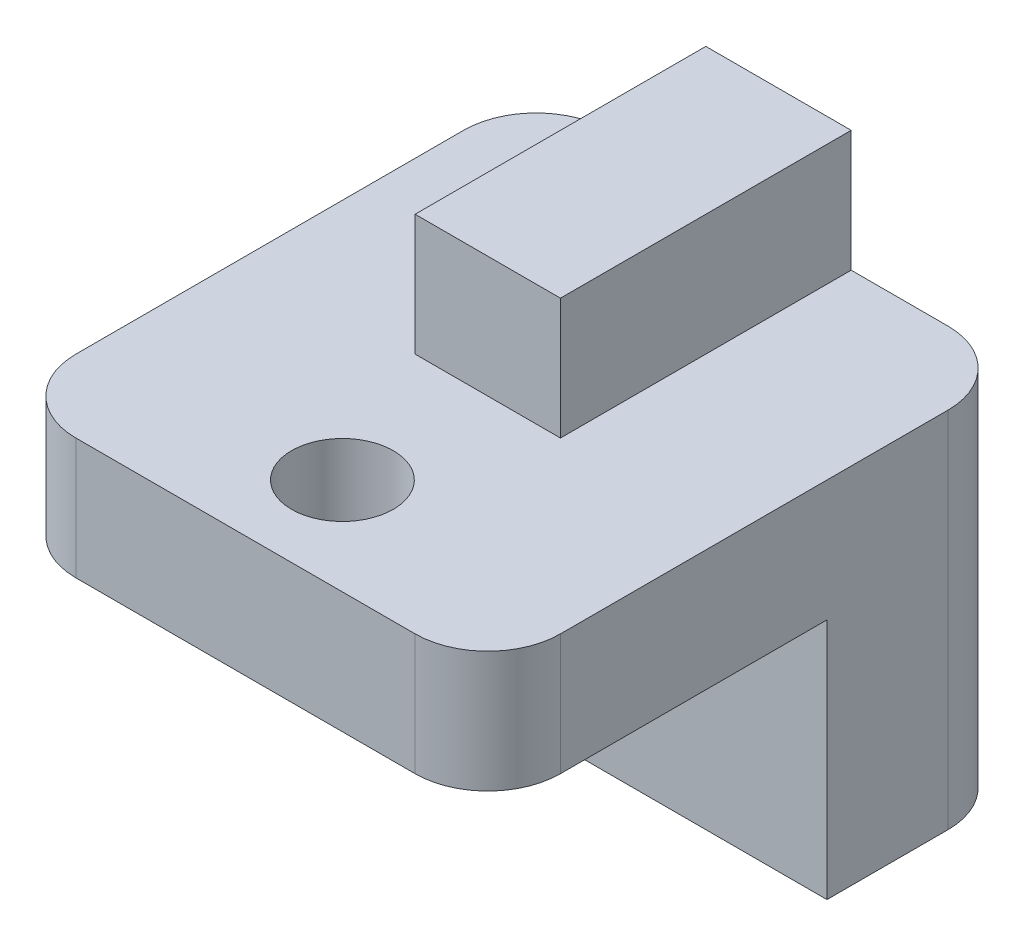
ISO-10303-21;
HEADER;
FILE_DESCRIPTION(('STEP AP214'),'2;1');
FILE_NAME('part.step','',(''),(''),'','','');
FILE_SCHEMA(('AUTOMOTIVE_DESIGN { 1 0 10303 214 1 1 1 1 }'));
ENDSEC;
DATA;
#1=APPLICATION_CONTEXT('core data for automotive mechanical design processes');
#2=APPLICATION_PROTOCOL_DEFINITION('international standard','automotive_design',2000,#1);
#3=PRODUCT_CONTEXT('',#1,'mechanical');
#4=PRODUCT('Part','Part','',(#3));
#5=PRODUCT_RELATED_PRODUCT_CATEGORY('part','',(#4));
#6=PRODUCT_DEFINITION_FORMATION('','',#4);
#7=PRODUCT_DEFINITION_CONTEXT('part definition',#1,'design');
#8=PRODUCT_DEFINITION('design','',#6,#7);
#9=PRODUCT_DEFINITION_SHAPE('','',#8);
#10=(LENGTH_UNIT() NAMED_UNIT(*) SI_UNIT(.MILLI.,.METRE.));
#11=(NAMED_UNIT(*) PLANE_ANGLE_UNIT() SI_UNIT($,.RADIAN.));
#12=(NAMED_UNIT(*) SI_UNIT($,.STERADIAN.) SOLID_ANGLE_UNIT());
#13=UNCERTAINTY_MEASURE_WITH_UNIT(LENGTH_MEASURE(1.E-05),#10,'distance_accuracy_value','');
#14=(GEOMETRIC_REPRESENTATION_CONTEXT(3) GLOBAL_UNCERTAINTY_ASSIGNED_CONTEXT((#13)) GLOBAL_UNIT_ASSIGNED_CONTEXT((#10,
#11,#12)) REPRESENTATION_CONTEXT('',''));
#15=CARTESIAN_POINT('',(0.,0.,0.));
#16=DIRECTION('',(0.,0.,1.));
#17=DIRECTION('',(1.,0.,0.));
#18=AXIS2_PLACEMENT_3D('',#15,#16,#17);
#19=CARTESIAN_POINT('',(0.,0.,0.));
#20=DIRECTION('',(0.,1.,0.));
#21=DIRECTION('',(0.,0.,1.));
#22=AXIS2_PLACEMENT_3D('',#19,#20,#21);
#23=PLANE('',#22);
#24=CARTESIAN_POINT('',(10.,0.,-4.));
#25=DIRECTION('',(0.,1.,0.));
#26=DIRECTION('',(0.,0.,1.));
#27=AXIS2_PLACEMENT_3D('',#24,#25,#26);
#28=CIRCLE('',#27,2.1);
#29=CARTESIAN_POINT('',(10.,0.,-1.9));
#30=VERTEX_POINT('',#29);
#31=EDGE_CURVE('E221',#30,#30,#28,.T.);
#32=ORIENTED_EDGE('',*,*,#31,.T.);
#33=EDGE_LOOP('',(#32));
#34=FACE_BOUND('',#33,.T.);
#35=DIRECTION('',(-1.,0.,0.));
#36=VECTOR('',#35,1.);
#37=CARTESIAN_POINT('',(20.,0.,-14.));
#38=LINE('',#37,#36);
#39=CARTESIAN_POINT('',(20.,0.,-14.));
#40=VERTEX_POINT('',#39);
#41=CARTESIAN_POINT('',(0.,0.,-14.));
#42=VERTEX_POINT('',#41);
#43=EDGE_CURVE('E54',#40,#42,#38,.T.);
#44=ORIENTED_EDGE('',*,*,#43,.F.);
#45=DIRECTION('',(0.,0.,-1.));
#46=VECTOR('',#45,1.);
#47=CARTESIAN_POINT('',(20.,0.,0.));
#48=LINE('',#47,#46);
#49=CARTESIAN_POINT('',(20.,0.,-3.));
#50=VERTEX_POINT('',#49);
#51=EDGE_CURVE('E245',#50,#40,#48,.T.);
#52=ORIENTED_EDGE('',*,*,#51,.F.);
#53=CARTESIAN_POINT('',(17.,0.,-3.));
#54=DIRECTION('',(0.,1.,0.));
#55=DIRECTION('',(0.,0.,1.));
#56=AXIS2_PLACEMENT_3D('',#53,#54,#55);
#57=CIRCLE('',#56,3.);
#58=CARTESIAN_POINT('',(17.,0.,0.));
#59=VERTEX_POINT('',#58);
#60=EDGE_CURVE('E472',#50,#59,#57,.F.);
#61=ORIENTED_EDGE('',*,*,#60,.T.);
#62=DIRECTION('',(1.,0.,0.));
#63=VECTOR('',#62,1.);
#64=CARTESIAN_POINT('',(0.,0.,0.));
#65=LINE('',#64,#63);
#66=CARTESIAN_POINT('',(3.,0.,0.));
#67=VERTEX_POINT('',#66);
#68=EDGE_CURVE('E252',#67,#59,#65,.T.);
#69=ORIENTED_EDGE('',*,*,#68,.F.);
#70=CARTESIAN_POINT('',(3.,0.,-3.));
#71=DIRECTION('',(0.,1.,0.));
#72=DIRECTION('',(0.,0.,1.));
#73=AXIS2_PLACEMENT_3D('',#70,#71,#72);
#74=CIRCLE('',#73,3.);
#75=CARTESIAN_POINT('',(0.,0.,-3.));
#76=VERTEX_POINT('',#75);
#77=EDGE_CURVE('E456',#67,#76,#74,.F.);
#78=ORIENTED_EDGE('',*,*,#77,.T.);
#79=DIRECTION('',(0.,0.,-1.));
#80=VECTOR('',#79,1.);
#81=CARTESIAN_POINT('',(0.,0.,0.));
#82=LINE('',#81,#80);
#83=EDGE_CURVE('E185',#76,#42,#82,.T.);
#84=ORIENTED_EDGE('',*,*,#83,.T.);
#85=EDGE_LOOP('',(#44,#52,#61,#69,#78,#84));
#86=FACE_BOUND('',#85,.T.);
#87=ADVANCED_FACE('F37',(#34,#86),#23,.F.);
#88=CARTESIAN_POINT('',(0.,5.,0.));
#89=DIRECTION('',(0.,1.,0.));
#90=DIRECTION('',(0.,0.,1.));
#91=AXIS2_PLACEMENT_3D('',#88,#89,#90);
#92=PLANE('',#91);
#93=CARTESIAN_POINT('',(10.,5.,-4.));
#94=DIRECTION('',(0.,1.,0.));
#95=DIRECTION('',(0.,0.,1.));
#96=AXIS2_PLACEMENT_3D('',#93,#94,#95);
#97=CIRCLE('',#96,2.1);
#98=CARTESIAN_POINT('',(10.,5.,-1.9));
#99=VERTEX_POINT('',#98);
#100=EDGE_CURVE('E152',#99,#99,#97,.T.);
#101=ORIENTED_EDGE('',*,*,#100,.F.);
#102=EDGE_LOOP('',(#101));
#103=FACE_BOUND('',#102,.T.);
#104=DIRECTION('',(1.,0.,0.));
#105=VECTOR('',#104,1.);
#106=CARTESIAN_POINT('',(0.,5.,0.));
#107=LINE('',#106,#105);
#108=CARTESIAN_POINT('',(3.,5.,0.));
#109=VERTEX_POINT('',#108);
#110=CARTESIAN_POINT('',(17.,5.,0.));
#111=VERTEX_POINT('',#110);
#112=EDGE_CURVE('E461',#109,#111,#107,.T.);
#113=ORIENTED_EDGE('',*,*,#112,.T.);
#114=CARTESIAN_POINT('',(17.,5.,-3.));
#115=DIRECTION('',(0.,1.,0.));
#116=DIRECTION('',(0.,0.,1.));
#117=AXIS2_PLACEMENT_3D('',#114,#115,#116);
#118=CIRCLE('',#117,3.);
#119=CARTESIAN_POINT('',(20.,5.,-3.));
#120=VERTEX_POINT('',#119);
#121=EDGE_CURVE('E239',#111,#120,#118,.T.);
#122=ORIENTED_EDGE('',*,*,#121,.T.);
#123=DIRECTION('',(0.,0.,-1.));
#124=VECTOR('',#123,1.);
#125=CARTESIAN_POINT('',(20.,5.,0.));
#126=LINE('',#125,#124);
#127=CARTESIAN_POINT('',(20.,5.,-19.));
#128=VERTEX_POINT('',#127);
#129=EDGE_CURVE('E218',#120,#128,#126,.T.);
#130=ORIENTED_EDGE('',*,*,#129,.T.);
#131=CARTESIAN_POINT('',(17.,5.,-19.));
#132=DIRECTION('',(0.,1.,0.));
#133=DIRECTION('',(0.,0.,1.));
#134=AXIS2_PLACEMENT_3D('',#131,#132,#133);
#135=CIRCLE('',#134,3.);
#136=CARTESIAN_POINT('',(17.,5.,-22.));
#137=VERTEX_POINT('',#136);
#138=EDGE_CURVE('E147',#128,#137,#135,.T.);
#139=ORIENTED_EDGE('',*,*,#138,.T.);
#140=DIRECTION('',(1.,0.,0.));
#141=VECTOR('',#140,1.);
#142=CARTESIAN_POINT('',(0.,5.,-22.));
#143=LINE('',#142,#141);
#144=CARTESIAN_POINT('',(13.,5.,-22.));
#145=VERTEX_POINT('',#144);
#146=EDGE_CURVE('E220',#145,#137,#143,.T.);
#147=ORIENTED_EDGE('',*,*,#146,.F.);
#148=DIRECTION('',(0.,0.,1.));
#149=VECTOR('',#148,1.);
#150=CARTESIAN_POINT('',(13.,5.,0.));
#151=LINE('',#150,#149);
#152=CARTESIAN_POINT('',(13.,5.,-10.));
#153=VERTEX_POINT('',#152);
#154=EDGE_CURVE('E191',#145,#153,#151,.T.);
#155=ORIENTED_EDGE('',*,*,#154,.T.);
#156=DIRECTION('',(1.,0.,0.));
#157=VECTOR('',#156,1.);
#158=CARTESIAN_POINT('',(0.,5.,-10.));
#159=LINE('',#158,#157);
#160=CARTESIAN_POINT('',(6.99999999999999,5.,-10.));
#161=VERTEX_POINT('',#160);
#162=EDGE_CURVE('E198',#161,#153,#159,.T.);
#163=ORIENTED_EDGE('',*,*,#162,.F.);
#164=DIRECTION('',(0.,0.,1.));
#165=VECTOR('',#164,1.);
#166=CARTESIAN_POINT('',(7.,5.,0.));
#167=LINE('',#166,#165);
#168=CARTESIAN_POINT('',(6.99999999999999,5.,-22.));
#169=VERTEX_POINT('',#168);
#170=EDGE_CURVE('E193',#169,#161,#167,.T.);
#171=ORIENTED_EDGE('',*,*,#170,.F.);
#172=CARTESIAN_POINT('',(3.,5.,-22.));
#173=VERTEX_POINT('',#172);
#174=EDGE_CURVE('E230',#173,#169,#143,.T.);
#175=ORIENTED_EDGE('',*,*,#174,.F.);
#176=CARTESIAN_POINT('',(3.,5.,-19.));
#177=DIRECTION('',(0.,1.,0.));
#178=DIRECTION('',(0.,0.,1.));
#179=AXIS2_PLACEMENT_3D('',#176,#177,#178);
#180=CIRCLE('',#179,3.);
#181=CARTESIAN_POINT('',(0.,5.,-19.));
#182=VERTEX_POINT('',#181);
#183=EDGE_CURVE('E62',#173,#182,#180,.T.);
#184=ORIENTED_EDGE('',*,*,#183,.T.);
#185=DIRECTION('',(0.,0.,-1.));
#186=VECTOR('',#185,1.);
#187=CARTESIAN_POINT('',(0.,5.,0.));
#188=LINE('',#187,#186);
#189=CARTESIAN_POINT('',(0.,5.,-3.));
#190=VERTEX_POINT('',#189);
#191=EDGE_CURVE('E224',#190,#182,#188,.T.);
#192=ORIENTED_EDGE('',*,*,#191,.F.);
#193=CARTESIAN_POINT('',(3.,5.,-3.));
#194=DIRECTION('',(0.,1.,0.));
#195=DIRECTION('',(0.,0.,1.));
#196=AXIS2_PLACEMENT_3D('',#193,#194,#195);
#197=CIRCLE('',#196,3.);
#198=EDGE_CURVE('E237',#190,#109,#197,.T.);
#199=ORIENTED_EDGE('',*,*,#198,.T.);
#200=EDGE_LOOP('',(#113,#122,#130,#139,#147,#155,#163,#171,#175,#184,#192,#199));
#201=FACE_BOUND('',#200,.T.);
#202=ADVANCED_FACE('F277',(#103,#201),#92,.T.);
#203=CARTESIAN_POINT('',(20.,5.,0.));
#204=DIRECTION('',(-1.,0.,0.));
#205=DIRECTION('',(0.,0.,1.));
#206=AXIS2_PLACEMENT_3D('',#203,#204,#205);
#207=PLANE('',#206);
#208=ORIENTED_EDGE('',*,*,#129,.F.);
#209=DIRECTION('',(0.,-1.,0.));
#210=VECTOR('',#209,1.);
#211=CARTESIAN_POINT('',(20.,5.,-3.));
#212=LINE('',#211,#210);
#213=EDGE_CURVE('E151',#120,#50,#212,.T.);
#214=ORIENTED_EDGE('',*,*,#213,.T.);
#215=ORIENTED_EDGE('',*,*,#51,.T.);
#216=DIRECTION('',(0.,1.,0.));
#217=VECTOR('',#216,1.);
#218=CARTESIAN_POINT('',(20.,-10.,-14.));
#219=LINE('',#218,#217);
#220=CARTESIAN_POINT('',(20.,-10.,-14.));
#221=VERTEX_POINT('',#220);
#222=EDGE_CURVE('E158',#221,#40,#219,.T.);
#223=ORIENTED_EDGE('',*,*,#222,.F.);
#224=DIRECTION('',(0.,0.,1.));
#225=VECTOR('',#224,1.);
#226=CARTESIAN_POINT('',(20.,-10.,-14.));
#227=LINE('',#226,#225);
#228=CARTESIAN_POINT('',(20.,-10.,-19.));
#229=VERTEX_POINT('',#228);
#230=EDGE_CURVE('E155',#229,#221,#227,.T.);
#231=ORIENTED_EDGE('',*,*,#230,.F.);
#232=DIRECTION('',(0.,-1.,0.));
#233=VECTOR('',#232,1.);
#234=CARTESIAN_POINT('',(20.,5.,-19.));
#235=LINE('',#234,#233);
#236=EDGE_CURVE('E142',#229,#128,#235,.F.);
#237=ORIENTED_EDGE('',*,*,#236,.T.);
#238=EDGE_LOOP('',(#208,#214,#215,#223,#231,#237));
#239=FACE_BOUND('',#238,.T.);
#240=ADVANCED_FACE('F156',(#239),#207,.F.);
#241=CARTESIAN_POINT('',(0.,5.,-22.));
#242=DIRECTION('',(0.,0.,-1.));
#243=DIRECTION('',(-1.,0.,0.));
#244=AXIS2_PLACEMENT_3D('',#241,#242,#243);
#245=PLANE('',#244);
#246=DIRECTION('',(0.,-1.,0.));
#247=VECTOR('',#246,1.);
#248=CARTESIAN_POINT('',(17.,0.,-22.));
#249=LINE('',#248,#247);
#250=CARTESIAN_POINT('',(17.,-10.,-22.));
#251=VERTEX_POINT('',#250);
#252=EDGE_CURVE('E46',#137,#251,#249,.T.);
#253=ORIENTED_EDGE('',*,*,#252,.T.);
#254=DIRECTION('',(1.,0.,0.));
#255=VECTOR('',#254,1.);
#256=CARTESIAN_POINT('',(3.,-10.,-22.));
#257=LINE('',#256,#255);
#258=CARTESIAN_POINT('',(3.,-10.,-22.));
#259=VERTEX_POINT('',#258);
#260=EDGE_CURVE('E167',#259,#251,#257,.T.);
#261=ORIENTED_EDGE('',*,*,#260,.F.);
#262=DIRECTION('',(0.,-1.,0.));
#263=VECTOR('',#262,1.);
#264=CARTESIAN_POINT('',(3.,5.,-22.));
#265=LINE('',#264,#263);
#266=EDGE_CURVE('E11',#259,#173,#265,.F.);
#267=ORIENTED_EDGE('',*,*,#266,.T.);
#268=ORIENTED_EDGE('',*,*,#174,.T.);
#269=DIRECTION('',(0.,-1.,0.));
#270=VECTOR('',#269,1.);
#271=CARTESIAN_POINT('',(6.99999999999999,10.,-22.));
#272=LINE('',#271,#270);
#273=CARTESIAN_POINT('',(6.99999999999999,10.,-22.));
#274=VERTEX_POINT('',#273);
#275=EDGE_CURVE('E217',#274,#169,#272,.T.);
#276=ORIENTED_EDGE('',*,*,#275,.F.);
#277=DIRECTION('',(1.,0.,0.));
#278=VECTOR('',#277,1.);
#279=CARTESIAN_POINT('',(0.,10.,-22.));
#280=LINE('',#279,#278);
#281=CARTESIAN_POINT('',(13.,10.,-22.));
#282=VERTEX_POINT('',#281);
#283=EDGE_CURVE('E476',#274,#282,#280,.T.);
#284=ORIENTED_EDGE('',*,*,#283,.T.);
#285=DIRECTION('',(0.,-1.,0.));
#286=VECTOR('',#285,1.);
#287=CARTESIAN_POINT('',(13.,10.,-22.));
#288=LINE('',#287,#286);
#289=EDGE_CURVE('E247',#282,#145,#288,.T.);
#290=ORIENTED_EDGE('',*,*,#289,.T.);
#291=ORIENTED_EDGE('',*,*,#146,.T.);
#292=EDGE_LOOP('',(#253,#261,#267,#268,#276,#284,#290,#291));
#293=FACE_BOUND('',#292,.T.);
#294=ADVANCED_FACE('F373',(#293),#245,.T.);
#295=CARTESIAN_POINT('',(0.,5.,0.));
#296=DIRECTION('',(-1.,0.,0.));
#297=DIRECTION('',(0.,0.,1.));
#298=AXIS2_PLACEMENT_3D('',#295,#296,#297);
#299=PLANE('',#298);
#300=ORIENTED_EDGE('',*,*,#83,.F.);
#301=DIRECTION('',(0.,-1.,0.));
#302=VECTOR('',#301,1.);
#303=CARTESIAN_POINT('',(0.,5.,-3.));
#304=LINE('',#303,#302);
#305=EDGE_CURVE('E243',#76,#190,#304,.F.);
#306=ORIENTED_EDGE('',*,*,#305,.T.);
#307=ORIENTED_EDGE('',*,*,#191,.T.);
#308=DIRECTION('',(0.,-1.,0.));
#309=VECTOR('',#308,1.);
#310=CARTESIAN_POINT('',(0.,5.,-19.));
#311=LINE('',#310,#309);
#312=CARTESIAN_POINT('',(0.,-10.,-19.));
#313=VERTEX_POINT('',#312);
#314=EDGE_CURVE('E241',#182,#313,#311,.T.);
#315=ORIENTED_EDGE('',*,*,#314,.T.);
#316=DIRECTION('',(0.,0.,-1.));
#317=VECTOR('',#316,1.);
#318=CARTESIAN_POINT('',(0.,-10.,-14.));
#319=LINE('',#318,#317);
#320=CARTESIAN_POINT('',(0.,-10.,-14.));
#321=VERTEX_POINT('',#320);
#322=EDGE_CURVE('E172',#321,#313,#319,.T.);
#323=ORIENTED_EDGE('',*,*,#322,.F.);
#324=DIRECTION('',(0.,1.,0.));
#325=VECTOR('',#324,1.);
#326=CARTESIAN_POINT('',(0.,-10.,-14.));
#327=LINE('',#326,#325);
#328=EDGE_CURVE('E178',#321,#42,#327,.T.);
#329=ORIENTED_EDGE('',*,*,#328,.T.);
#330=EDGE_LOOP('',(#300,#306,#307,#315,#323,#329));
#331=FACE_BOUND('',#330,.T.);
#332=ADVANCED_FACE('F271',(#331),#299,.T.);
#333=CARTESIAN_POINT('',(0.,5.,0.));
#334=DIRECTION('',(0.,0.,-1.));
#335=DIRECTION('',(-1.,0.,0.));
#336=AXIS2_PLACEMENT_3D('',#333,#334,#335);
#337=PLANE('',#336);
#338=ORIENTED_EDGE('',*,*,#68,.T.);
#339=DIRECTION('',(0.,-1.,0.));
#340=VECTOR('',#339,1.);
#341=CARTESIAN_POINT('',(17.,5.,0.));
#342=LINE('',#341,#340);
#343=EDGE_CURVE('E233',#59,#111,#342,.F.);
#344=ORIENTED_EDGE('',*,*,#343,.T.);
#345=ORIENTED_EDGE('',*,*,#112,.F.);
#346=DIRECTION('',(0.,-1.,0.));
#347=VECTOR('',#346,1.);
#348=CARTESIAN_POINT('',(3.,0.,0.));
#349=LINE('',#348,#347);
#350=EDGE_CURVE('E458',#109,#67,#349,.T.);
#351=ORIENTED_EDGE('',*,*,#350,.T.);
#352=EDGE_LOOP('',(#338,#344,#345,#351));
#353=FACE_BOUND('',#352,.T.);
#354=ADVANCED_FACE('F261',(#353),#337,.F.);
#355=CARTESIAN_POINT('',(10.,5.,-4.));
#356=DIRECTION('',(0.,-1.,0.));
#357=DIRECTION('',(0.,0.,-1.));
#358=AXIS2_PLACEMENT_3D('',#355,#356,#357);
#359=CYLINDRICAL_SURFACE('',#358,2.1);
#360=ORIENTED_EDGE('',*,*,#100,.T.);
#361=EDGE_LOOP('',(#360));
#362=FACE_BOUND('',#361,.T.);
#363=ORIENTED_EDGE('',*,*,#31,.F.);
#364=EDGE_LOOP('',(#363));
#365=FACE_BOUND('',#364,.T.);
#366=ADVANCED_FACE('F258',(#362,#365),#359,.F.);
#367=CARTESIAN_POINT('',(13.,10.,0.));
#368=DIRECTION('',(1.,0.,0.));
#369=DIRECTION('',(0.,0.,-1.));
#370=AXIS2_PLACEMENT_3D('',#367,#368,#369);
#371=PLANE('',#370);
#372=ORIENTED_EDGE('',*,*,#154,.F.);
#373=ORIENTED_EDGE('',*,*,#289,.F.);
#374=DIRECTION('',(0.,0.,1.));
#375=VECTOR('',#374,1.);
#376=CARTESIAN_POINT('',(13.,10.,0.));
#377=LINE('',#376,#375);
#378=CARTESIAN_POINT('',(13.,10.,-10.));
#379=VERTEX_POINT('',#378);
#380=EDGE_CURVE('E181',#282,#379,#377,.T.);
#381=ORIENTED_EDGE('',*,*,#380,.T.);
#382=DIRECTION('',(0.,-1.,0.));
#383=VECTOR('',#382,1.);
#384=CARTESIAN_POINT('',(13.,10.,-10.));
#385=LINE('',#384,#383);
#386=EDGE_CURVE('E212',#379,#153,#385,.T.);
#387=ORIENTED_EDGE('',*,*,#386,.T.);
#388=EDGE_LOOP('',(#372,#373,#381,#387));
#389=FACE_BOUND('',#388,.T.);
#390=ADVANCED_FACE('F260',(#389),#371,.T.);
#391=CARTESIAN_POINT('',(7.,10.,0.));
#392=DIRECTION('',(1.,0.,0.));
#393=DIRECTION('',(0.,0.,-1.));
#394=AXIS2_PLACEMENT_3D('',#391,#392,#393);
#395=PLANE('',#394);
#396=ORIENTED_EDGE('',*,*,#170,.T.);
#397=DIRECTION('',(0.,-1.,0.));
#398=VECTOR('',#397,1.);
#399=CARTESIAN_POINT('',(6.99999999999999,10.,-10.));
#400=LINE('',#399,#398);
#401=CARTESIAN_POINT('',(6.99999999999999,10.,-10.));
#402=VERTEX_POINT('',#401);
#403=EDGE_CURVE('E214',#402,#161,#400,.T.);
#404=ORIENTED_EDGE('',*,*,#403,.F.);
#405=DIRECTION('',(0.,0.,1.));
#406=VECTOR('',#405,1.);
#407=CARTESIAN_POINT('',(7.,10.,0.));
#408=LINE('',#407,#406);
#409=EDGE_CURVE('E485',#274,#402,#408,.T.);
#410=ORIENTED_EDGE('',*,*,#409,.F.);
#411=ORIENTED_EDGE('',*,*,#275,.T.);
#412=EDGE_LOOP('',(#396,#404,#410,#411));
#413=FACE_BOUND('',#412,.T.);
#414=ADVANCED_FACE('F268',(#413),#395,.F.);
#415=CARTESIAN_POINT('',(0.,10.,-10.));
#416=DIRECTION('',(0.,0.,-1.));
#417=DIRECTION('',(-1.,0.,0.));
#418=AXIS2_PLACEMENT_3D('',#415,#416,#417);
#419=PLANE('',#418);
#420=ORIENTED_EDGE('',*,*,#162,.T.);
#421=ORIENTED_EDGE('',*,*,#386,.F.);
#422=DIRECTION('',(1.,0.,0.));
#423=VECTOR('',#422,1.);
#424=CARTESIAN_POINT('',(0.,10.,-10.));
#425=LINE('',#424,#423);
#426=EDGE_CURVE('E208',#402,#379,#425,.T.);
#427=ORIENTED_EDGE('',*,*,#426,.F.);
#428=ORIENTED_EDGE('',*,*,#403,.T.);
#429=EDGE_LOOP('',(#420,#421,#427,#428));
#430=FACE_BOUND('',#429,.T.);
#431=ADVANCED_FACE('F286',(#430),#419,.F.);
#432=CARTESIAN_POINT('',(0.,10.,0.));
#433=DIRECTION('',(0.,1.,0.));
#434=DIRECTION('',(0.,0.,1.));
#435=AXIS2_PLACEMENT_3D('',#432,#433,#434);
#436=PLANE('',#435);
#437=ORIENTED_EDGE('',*,*,#380,.F.);
#438=ORIENTED_EDGE('',*,*,#283,.F.);
#439=ORIENTED_EDGE('',*,*,#409,.T.);
#440=ORIENTED_EDGE('',*,*,#426,.T.);
#441=EDGE_LOOP('',(#437,#438,#439,#440));
#442=FACE_BOUND('',#441,.T.);
#443=ADVANCED_FACE('F290',(#442),#436,.T.);
#444=CARTESIAN_POINT('',(17.,5.,-3.));
#445=DIRECTION('',(0.,-1.,0.));
#446=DIRECTION('',(0.,0.,-1.));
#447=AXIS2_PLACEMENT_3D('',#444,#445,#446);
#448=CYLINDRICAL_SURFACE('',#447,3.);
#449=ORIENTED_EDGE('',*,*,#121,.F.);
#450=ORIENTED_EDGE('',*,*,#343,.F.);
#451=ORIENTED_EDGE('',*,*,#60,.F.);
#452=ORIENTED_EDGE('',*,*,#213,.F.);
#453=EDGE_LOOP('',(#449,#450,#451,#452));
#454=FACE_BOUND('',#453,.T.);
#455=ADVANCED_FACE('F294',(#454),#448,.T.);
#456=CARTESIAN_POINT('',(3.,5.,-3.));
#457=DIRECTION('',(0.,1.,0.));
#458=DIRECTION('',(0.,0.,1.));
#459=AXIS2_PLACEMENT_3D('',#456,#457,#458);
#460=CYLINDRICAL_SURFACE('',#459,3.);
#461=ORIENTED_EDGE('',*,*,#198,.F.);
#462=ORIENTED_EDGE('',*,*,#305,.F.);
#463=ORIENTED_EDGE('',*,*,#77,.F.);
#464=ORIENTED_EDGE('',*,*,#350,.F.);
#465=EDGE_LOOP('',(#461,#462,#463,#464));
#466=FACE_BOUND('',#465,.T.);
#467=ADVANCED_FACE('F318',(#466),#460,.T.);
#468=CARTESIAN_POINT('',(3.,5.,-19.));
#469=DIRECTION('',(0.,-1.,0.));
#470=DIRECTION('',(0.,0.,-1.));
#471=AXIS2_PLACEMENT_3D('',#468,#469,#470);
#472=CYLINDRICAL_SURFACE('',#471,3.);
#473=ORIENTED_EDGE('',*,*,#183,.F.);
#474=ORIENTED_EDGE('',*,*,#266,.F.);
#475=CARTESIAN_POINT('',(3.,-10.,-19.));
#476=DIRECTION('',(0.,-1.,0.));
#477=DIRECTION('',(0.,0.,-1.));
#478=AXIS2_PLACEMENT_3D('',#475,#476,#477);
#479=CIRCLE('',#478,3.);
#480=EDGE_CURVE('E175',#313,#259,#479,.T.);
#481=ORIENTED_EDGE('',*,*,#480,.F.);
#482=ORIENTED_EDGE('',*,*,#314,.F.);
#483=EDGE_LOOP('',(#473,#474,#481,#482));
#484=FACE_BOUND('',#483,.T.);
#485=ADVANCED_FACE('F312',(#484),#472,.T.);
#486=CARTESIAN_POINT('',(17.,5.,-19.));
#487=DIRECTION('',(0.,1.,0.));
#488=DIRECTION('',(0.,0.,1.));
#489=AXIS2_PLACEMENT_3D('',#486,#487,#488);
#490=CYLINDRICAL_SURFACE('',#489,3.);
#491=ORIENTED_EDGE('',*,*,#138,.F.);
#492=ORIENTED_EDGE('',*,*,#236,.F.);
#493=CARTESIAN_POINT('',(17.,-10.,-19.));
#494=DIRECTION('',(0.,-1.,0.));
#495=DIRECTION('',(0.,0.,-1.));
#496=AXIS2_PLACEMENT_3D('',#493,#494,#495);
#497=CIRCLE('',#496,3.);
#498=EDGE_CURVE('E146',#251,#229,#497,.T.);
#499=ORIENTED_EDGE('',*,*,#498,.F.);
#500=ORIENTED_EDGE('',*,*,#252,.F.);
#501=EDGE_LOOP('',(#491,#492,#499,#500));
#502=FACE_BOUND('',#501,.T.);
#503=ADVANCED_FACE('F39',(#502),#490,.T.);
#504=CARTESIAN_POINT('',(20.,-10.,-14.));
#505=DIRECTION('',(0.,0.,-1.));
#506=DIRECTION('',(-1.,0.,0.));
#507=AXIS2_PLACEMENT_3D('',#504,#505,#506);
#508=PLANE('',#507);
#509=ORIENTED_EDGE('',*,*,#43,.T.);
#510=ORIENTED_EDGE('',*,*,#328,.F.);
#511=DIRECTION('',(-1.,0.,0.));
#512=VECTOR('',#511,1.);
#513=CARTESIAN_POINT('',(20.,-10.,-14.));
#514=LINE('',#513,#512);
#515=EDGE_CURVE('E161',#221,#321,#514,.T.);
#516=ORIENTED_EDGE('',*,*,#515,.F.);
#517=ORIENTED_EDGE('',*,*,#222,.T.);
#518=EDGE_LOOP('',(#509,#510,#516,#517));
#519=FACE_BOUND('',#518,.T.);
#520=ADVANCED_FACE('F296',(#519),#508,.F.);
#521=CARTESIAN_POINT('',(17.,-10.,-19.));
#522=DIRECTION('',(0.,-1.,0.));
#523=DIRECTION('',(0.,0.,-1.));
#524=AXIS2_PLACEMENT_3D('',#521,#522,#523);
#525=PLANE('',#524);
#526=ORIENTED_EDGE('',*,*,#498,.T.);
#527=ORIENTED_EDGE('',*,*,#230,.T.);
#528=ORIENTED_EDGE('',*,*,#515,.T.);
#529=ORIENTED_EDGE('',*,*,#322,.T.);
#530=ORIENTED_EDGE('',*,*,#480,.T.);
#531=ORIENTED_EDGE('',*,*,#260,.T.);
#532=EDGE_LOOP('',(#526,#527,#528,#529,#530,#531));
#533=FACE_BOUND('',#532,.T.);
#534=ADVANCED_FACE('F164',(#533),#525,.T.);
#535=CLOSED_SHELL('',(#87,#202,#240,#294,#332,#354,#366,#390,#414,#431,#443,#455,#467,#485,#503,
#520,#534));
#536=MANIFOLD_SOLID_BREP('B2',#535);
#537=ADVANCED_BREP_SHAPE_REPRESENTATION('',(#18,#536),#14);
#538=SHAPE_DEFINITION_REPRESENTATION(#9,#537);
ENDSEC;
END-ISO-10303-21;
